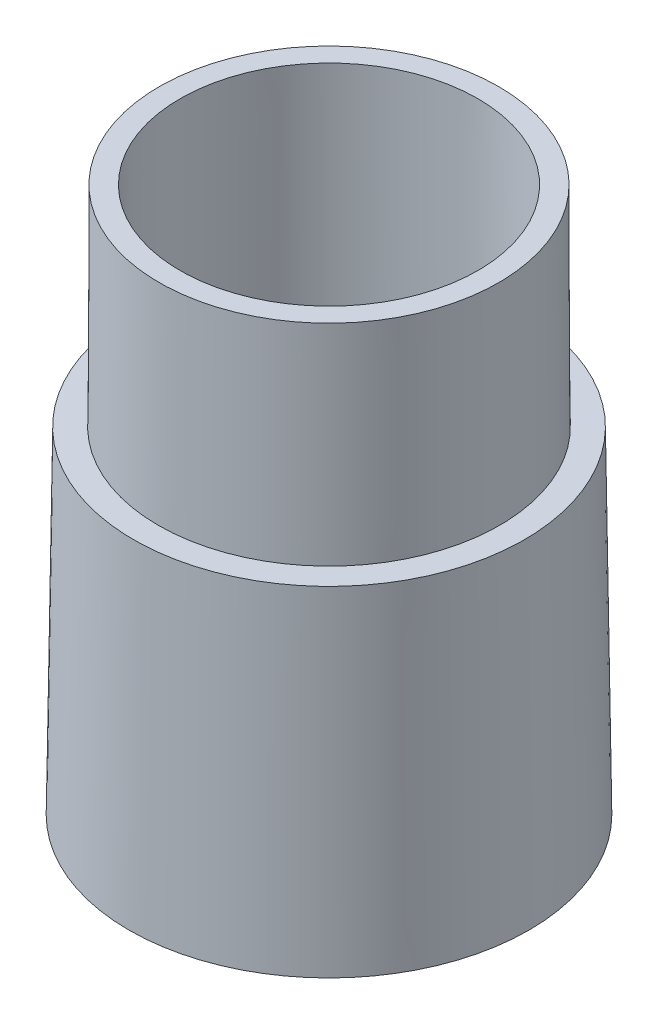
ISO-10303-21;
HEADER;
FILE_DESCRIPTION(('STEP AP214'),'2;1');
FILE_NAME('part.step','',(''),(''),'','','');
FILE_SCHEMA(('AUTOMOTIVE_DESIGN { 1 0 10303 214 1 1 1 1 }'));
ENDSEC;
DATA;
#1=APPLICATION_CONTEXT('core data for automotive mechanical design processes');
#2=APPLICATION_PROTOCOL_DEFINITION('international standard','automotive_design',2000,#1);
#3=PRODUCT_CONTEXT('',#1,'mechanical');
#4=PRODUCT('Part','Part','',(#3));
#5=PRODUCT_RELATED_PRODUCT_CATEGORY('part','',(#4));
#6=PRODUCT_DEFINITION_FORMATION('','',#4);
#7=PRODUCT_DEFINITION_CONTEXT('part definition',#1,'design');
#8=PRODUCT_DEFINITION('design','',#6,#7);
#9=PRODUCT_DEFINITION_SHAPE('','',#8);
#10=(LENGTH_UNIT() NAMED_UNIT(*) SI_UNIT(.MILLI.,.METRE.));
#11=(NAMED_UNIT(*) PLANE_ANGLE_UNIT() SI_UNIT($,.RADIAN.));
#12=(NAMED_UNIT(*) SI_UNIT($,.STERADIAN.) SOLID_ANGLE_UNIT());
#13=UNCERTAINTY_MEASURE_WITH_UNIT(LENGTH_MEASURE(1.E-05),#10,'distance_accuracy_value','');
#14=(GEOMETRIC_REPRESENTATION_CONTEXT(3) GLOBAL_UNCERTAINTY_ASSIGNED_CONTEXT((#13)) GLOBAL_UNIT_ASSIGNED_CONTEXT((#10,
#11,#12)) REPRESENTATION_CONTEXT('',''));
#15=CARTESIAN_POINT('',(0.,0.,0.));
#16=DIRECTION('',(0.,0.,1.));
#17=DIRECTION('',(1.,0.,0.));
#18=AXIS2_PLACEMENT_3D('',#15,#16,#17);
#19=CARTESIAN_POINT('',(0.,0.,0.));
#20=DIRECTION('',(0.,-1.,0.));
#21=DIRECTION('',(0.,0.,-1.));
#22=AXIS2_PLACEMENT_3D('',#19,#20,#21);
#23=CONICAL_SURFACE('',#22,8.81,0.0134964809963496);
#24=CARTESIAN_POINT('',(8.60823091124179,14.68,-0.249973663442214));
#25=CARTESIAN_POINT('',(8.61048079432087,14.5133788704425,-0.249973677197637));
#26=CARTESIAN_POINT('',(8.6127306766579,14.346757740875,-0.24997369093714));
#27=CARTESIAN_POINT('',(8.61948032144782,13.8468943521425,-0.249973732107752));
#28=CARTESIAN_POINT('',(8.62398008167954,13.5136520929476,-0.249973759490965));
#29=CARTESIAN_POINT('',(8.63297959624633,12.847167574478,-0.249973814128946));
#30=CARTESIAN_POINT('',(8.63747935058139,12.5139253152034,-0.249973841383713));
#31=CARTESIAN_POINT('',(8.64647885338279,11.8474407965749,-0.249973895766013));
#32=CARTESIAN_POINT('',(8.65097860184912,11.5141985372211,-0.249973922893545));
#33=CARTESIAN_POINT('',(8.65772822016752,11.0143351481312,-0.24997396348992));
#34=CARTESIAN_POINT('',(8.65997809221014,10.8477140184247,-0.249973977006225));
#35=CARTESIAN_POINT('',(8.66672770615257,10.3478506292757,-0.24997401750784));
#36=CARTESIAN_POINT('',(8.67122744586696,10.0146083698036,-0.249974044445849));
#37=CARTESIAN_POINT('',(8.6802269194951,9.34812385078127,-0.249974098196511));
#38=CARTESIAN_POINT('',(8.68472665340884,9.01488159123092,-0.249974125009163));
#39=CARTESIAN_POINT('',(8.69372611546264,8.34839707205227,-0.249974178509888));
#40=CARTESIAN_POINT('',(8.6982258436027,8.01515481242396,-0.249974205197961));
#41=CARTESIAN_POINT('',(8.70722529413595,7.34867029308974,-0.249974258450297));
#42=CARTESIAN_POINT('',(8.71172501652913,7.01542803338383,-0.249974285014562));
#43=CARTESIAN_POINT('',(8.71847459582874,6.51556464376704,-0.249974324768674));
#44=CARTESIAN_POINT('',(8.72072445488024,6.34894351388513,-0.249974338004665));
#45=CARTESIAN_POINT('',(8.72747402989463,5.84908012421047,-0.249974377666637));
#46=CARTESIAN_POINT('',(8.73197374371739,5.51583786438884,-0.249974404046619));
#47=CARTESIAN_POINT('',(8.74097316568232,4.84935334466887,-0.249974456684676));
#48=CARTESIAN_POINT('',(8.74547287382449,4.51611108477053,-0.24997448294275));
#49=CARTESIAN_POINT('',(8.75447228445447,3.8496265648975,-0.24997453533774));
#50=CARTESIAN_POINT('',(8.75897198694229,3.51638430492282,-0.249974561474655));
#51=CARTESIAN_POINT('',(8.76797138628963,2.84989978489744,-0.249974613628073));
#52=CARTESIAN_POINT('',(8.77247108314914,2.51665752484676,-0.249974639644575));
#53=CARTESIAN_POINT('',(8.77922062423663,2.016794134714,-0.249974678579571));
#54=CARTESIAN_POINT('',(8.7814704705655,1.85017300466029,-0.249974691542943));
#55=CARTESIAN_POINT('',(8.78750908318868,1.40295989555099,-0.249974726296762));
#56=CARTESIAN_POINT('',(8.79129784820028,1.12236791647808,-0.249974748059829));
#57=CARTESIAN_POINT('',(8.79887537427599,0.561183958278966,-0.249974791501812));
#58=CARTESIAN_POINT('',(8.80266413534011,0.280591979152757,-0.249974813180727));
#59=CARTESIAN_POINT('',(8.80645289443814,0.,-0.249974834817786));
#60=B_SPLINE_CURVE_WITH_KNOTS('',3,(#24,#25,#26,#27,#28,#29,#30,#31,#32,#33,#34,#35,#36,#37,#38,
#39,#40,#41,#42,#43,#44,#45,#46,#47,#48,#49,#50,#51,#52,#53,#54,#55,#56,#57,#58,#59),
.UNSPECIFIED.,.F.,.F.,(4,2,2,2,2,2,2,2,2,2,2,2,2,2,2,2,2,4),(0.,0.499908956811049,
1.49972687043315,2.49954478405525,3.49936269767735,3.99927165448839,4.99908956811049,
5.99890748173259,6.99872539535469,7.99854330897679,8.49845226578784,9.49827017940993,
10.498088093032,11.4979060066541,12.4977239202762,12.9976328770873,13.8394855489624,
14.6813382208375),.UNSPECIFIED.);
#61=CARTESIAN_POINT('',(8.6082309112409,14.68,-0.249973663441146));
#62=VERTEX_POINT('',#61);
#63=CARTESIAN_POINT('',(8.80645289443814,0.,-0.249974834817826));
#64=VERTEX_POINT('',#63);
#65=EDGE_CURVE('E117',#62,#64,#60,.T.);
#66=ORIENTED_EDGE('',*,*,#65,.F.);
#67=CARTESIAN_POINT('',(0.,14.68,0.));
#68=DIRECTION('',(0.,-1.,0.));
#69=DIRECTION('',(0.,0.,-1.));
#70=AXIS2_PLACEMENT_3D('',#67,#68,#69);
#71=CIRCLE('',#70,8.61185962807439);
#72=CARTESIAN_POINT('',(0.249973663441056,14.68,-8.6082309112409));
#73=VERTEX_POINT('',#72);
#74=EDGE_CURVE('E105',#73,#62,#71,.T.);
#75=ORIENTED_EDGE('',*,*,#74,.F.);
#76=CARTESIAN_POINT('',(0.249974834817693,0.,-8.80645289443814));
#77=CARTESIAN_POINT('',(0.249974821969175,0.166621129699813,-8.80420305350192));
#78=CARTESIAN_POINT('',(0.249974809105898,0.333242259390264,-8.80195321187241));
#79=CARTESIAN_POINT('',(0.249974744715482,1.16634790779561,-8.79070400025044));
#80=CARTESIAN_POINT('',(0.249974692966261,1.83283242636976,-8.78170461983467));
#81=CARTESIAN_POINT('',(0.249974588988193,3.16580146321502,-8.7637058365611));
#82=CARTESIAN_POINT('',(0.249974536759346,3.83228598148614,-8.75470643370331));
#83=CARTESIAN_POINT('',(0.249974431816078,5.16525501772254,-8.73670760533735));
#84=CARTESIAN_POINT('',(0.249974379101658,5.83173953568781,-8.72770817982918));
#85=CARTESIAN_POINT('',(0.249974273181206,7.16470857130967,-8.70970930595159));
#86=CARTESIAN_POINT('',(0.249974219975175,7.83119308896625,-8.70070985758216));
#87=CARTESIAN_POINT('',(0.24997411306537,9.16416212396785,-8.68271093776855));
#88=CARTESIAN_POINT('',(0.249974059361596,9.83064664131285,-8.67371146632436));
#89=CARTESIAN_POINT('',(0.249973977186892,10.8457035621321,-8.6600052400604));
#90=CARTESIAN_POINT('',(0.249973948899022,11.1942759657205,-8.65529849370074));
#91=CARTESIAN_POINT('',(0.249973878005905,12.0657069745836,-8.64353161979906));
#92=CARTESIAN_POINT('',(0.249973835313937,12.5885655798042,-8.63647148825576));
#93=CARTESIAN_POINT('',(0.249973749614724,13.6342827900494,-8.62235121065818));
#94=CARTESIAN_POINT('',(0.24997370660748,14.157141395074,-8.61529106460389));
#95=CARTESIAN_POINT('',(0.249973663441056,14.68,-8.6082309112409));
#96=B_SPLINE_CURVE_WITH_KNOTS('',3,(#76,#77,#78,#79,#80,#81,#82,#83,#84,#85,#86,#87,#88,#89,#90,
#91,#92,#93,#94,#95),.UNSPECIFIED.,.F.,.F.,(4,2,2,2,2,2,2,2,2,4),(0.,0.499908955531027,
2.49954477765514,4.49918059977925,6.49881642190336,8.49845224402747,10.4980880661516,
11.5439006048231,13.1126194128303,14.6813382208375),.UNSPECIFIED.);
#97=CARTESIAN_POINT('',(0.249974834817693,0.,-8.80645289443814));
#98=VERTEX_POINT('',#97);
#99=EDGE_CURVE('E47',#98,#73,#96,.T.);
#100=ORIENTED_EDGE('',*,*,#99,.F.);
#101=CARTESIAN_POINT('',(0.,0.,0.));
#102=DIRECTION('',(0.,-1.,0.));
#103=DIRECTION('',(0.,0.,-1.));
#104=AXIS2_PLACEMENT_3D('',#101,#102,#103);
#105=CIRCLE('',#104,8.81);
#106=EDGE_CURVE('E62',#98,#64,#105,.T.);
#107=ORIENTED_EDGE('',*,*,#106,.T.);
#108=EDGE_LOOP('',(#66,#75,#100,#107));
#109=FACE_BOUND('',#108,.T.);
#110=ADVANCED_FACE('F33',(#109),#23,.F.);
#111=CARTESIAN_POINT('',(8.80645289443808,0.,0.249974834817627));
#112=CARTESIAN_POINT('',(8.80420305350189,0.166621129699812,0.249974821969095));
#113=CARTESIAN_POINT('',(8.8019532118724,0.333242259390263,0.24997480910581));
#114=CARTESIAN_POINT('',(8.79520368489924,0.833105648433467,0.249974770471547));
#115=CARTESIAN_POINT('',(8.79070399747087,1.16634790775807,0.249974744656164));
#116=CARTESIAN_POINT('',(8.78170461702939,1.83283242633187,0.249974692906217));
#117=CARTESIAN_POINT('',(8.77720492401628,2.16607468558106,0.249974666971653));
#118=CARTESIAN_POINT('',(8.76820553237951,2.83255920400369,0.249974614982618));
#119=CARTESIAN_POINT('',(8.76370583375584,3.16580146317713,0.249974588928147));
#120=CARTESIAN_POINT('',(8.75470643087199,3.8322859814479,0.249974536698557));
#121=CARTESIAN_POINT('',(8.75020672661182,4.16552824054522,0.249974510523437));
#122=CARTESIAN_POINT('',(8.74120731242884,4.83201275866342,0.249974458051804));
#123=CARTESIAN_POINT('',(8.73670760250603,5.16525501768428,0.249974431755289));
#124=CARTESIAN_POINT('',(8.72770817697151,5.8317395356492,0.249974379040115));
#125=CARTESIAN_POINT('',(8.72320846135979,6.16498179459325,0.249974352621454));
#126=CARTESIAN_POINT('',(8.71420902442099,6.83146631240417,0.249974299661228));
#127=CARTESIAN_POINT('',(8.70970930309391,7.16470857127105,0.249974273119663));
#128=CARTESIAN_POINT('',(8.70295971679683,7.66457195951321,0.249974233214565));
#129=CARTESIAN_POINT('',(8.70070985398006,7.83119308891758,0.249974219897407));
#130=CARTESIAN_POINT('',(8.69396026337149,8.33105647710152,0.249974179899414));
#131=CARTESIAN_POINT('',(8.68946053342143,8.66429873585197,0.249974153172059));
#132=CARTESIAN_POINT('',(8.68046106773914,9.33078325327477,0.249974099592525));
#133=CARTESIAN_POINT('',(8.67596133200691,9.66402551194714,0.249974072740346));
#134=CARTESIAN_POINT('',(8.66696185473323,10.3305100292134,0.249974018910385));
#135=CARTESIAN_POINT('',(8.66246211319179,10.6637522878074,0.249973991932604));
#136=CARTESIAN_POINT('',(8.65571249650232,11.1636156756391,0.24997395137114));
#137=CARTESIAN_POINT('',(8.65346262354294,11.3302368049065,0.249973937834854));
#138=CARTESIAN_POINT('',(8.64671300247105,11.8301001926791,0.249973897178452));
#139=CARTESIAN_POINT('',(8.64221325216476,12.1633424511547,0.249973870010793));
#140=CARTESIAN_POINT('',(8.63279974133938,12.8604872580871,0.249973813042443));
#141=CARTESIAN_POINT('',(8.62788598025466,13.2243898065363,0.249973783229474));
#142=CARTESIAN_POINT('',(8.61805845104039,13.9521949033396,0.249973723450362));
#143=CARTESIAN_POINT('',(8.61314468291086,14.3160974516937,0.249973693484219));
#144=CARTESIAN_POINT('',(8.6082309112409,14.68,0.249973663440966));
#145=B_SPLINE_CURVE_WITH_KNOTS('',3,(#111,#112,#113,#114,#115,#116,#117,#118,#119,#120,#121,
#122,#123,#124,#125,#126,#127,#128,#129,#130,#131,#132,#133,#134,#135,#136,#137,#138,#139,#140,
#141,#142,#143,#144),.UNSPECIFIED.,.F.,.F.,(4,2,2,2,2,2,2,2,2,2,2,2,2,2,2,2,4),(0.,
0.499908955531025,1.49972686659307,2.49954477765512,3.49936268871717,4.49918059977923,
5.49899851084128,6.49881642190333,7.49863433296537,7.9985432884964,8.99836119955845,
9.9981791106205,10.9979970216826,11.4979059772136,12.4977238882756,13.5895310545566,
14.6813382208375),.UNSPECIFIED.);
#146=CARTESIAN_POINT('',(8.80645289443814,0.,0.249974834817641));
#147=VERTEX_POINT('',#146);
#148=CARTESIAN_POINT('',(8.6082309112409,14.68,0.24997366344097));
#149=VERTEX_POINT('',#148);
#150=EDGE_CURVE('E54',#147,#149,#145,.T.);
#151=ORIENTED_EDGE('',*,*,#150,.F.);
#152=CARTESIAN_POINT('',(0.249974834817734,0.,8.80645289443814));
#153=VERTEX_POINT('',#152);
#154=EDGE_CURVE('E208',#147,#153,#105,.T.);
#155=ORIENTED_EDGE('',*,*,#154,.T.);
#156=CARTESIAN_POINT('',(0.249973663441055,14.68,8.6082309112409));
#157=CARTESIAN_POINT('',(0.249973677197048,14.5133788704425,8.61048079432044));
#158=CARTESIAN_POINT('',(0.249973690936876,14.346757740875,8.61273067665775));
#159=CARTESIAN_POINT('',(0.249973759555432,13.5136520929876,8.6239800846417));
#160=CARTESIAN_POINT('',(0.249973814192425,12.8471675745176,8.63297959918067));
#161=CARTESIAN_POINT('',(0.24997392295712,11.5141985372607,8.65097860478353));
#162=CARTESIAN_POINT('',(0.249973977084823,10.8477140184738,8.65997809584741));
#163=CARTESIAN_POINT('',(0.249974084837249,9.51474498058589,8.67797705471856));
#164=CARTESIAN_POINT('',(0.249974138461971,8.84826046148492,8.68697652252581));
#165=CARTESIAN_POINT('',(0.249974245214647,7.51529142297186,8.70497543509946));
#166=CARTESIAN_POINT('',(0.249974298342601,6.84880690355977,8.71397487986584));
#167=CARTESIAN_POINT('',(0.24997440410786,5.51583786442736,8.73197374657087));
#168=CARTESIAN_POINT('',(0.249974456745164,4.84935334470704,8.74097316850952));
#169=CARTESIAN_POINT('',(0.249974536542811,3.83429642293051,8.75467928437489));
#170=CARTESIAN_POINT('',(0.249974563879188,3.48572402098524,8.75938598651703));
#171=CARTESIAN_POINT('',(0.249974632055494,2.61429301601816,8.77115273417648));
#172=CARTESIAN_POINT('',(0.249974672813105,2.09143441294439,8.77821277584587));
#173=CARTESIAN_POINT('',(0.249974754034819,1.04571720661113,8.79233284543175));
#174=CARTESIAN_POINT('',(0.249974794498923,0.522858603351655,8.79939287334824));
#175=CARTESIAN_POINT('',(0.249974834817693,0.,8.80645289443814));
#176=B_SPLINE_CURVE_WITH_KNOTS('',3,(#156,#157,#158,#159,#160,#161,#162,#163,#164,#165,#166,
#167,#168,#169,#170,#171,#172,#173,#174,#175),.UNSPECIFIED.,.F.,.F.,(4,2,2,2,2,2,2,2,2,4),(0.,
0.499908956811054,2.49954478405525,4.49918061129946,6.49881643854366,8.49845226578786,
10.4980880930321,11.5439006249834,13.1126194229105,14.6813382208375),.UNSPECIFIED.);
#177=CARTESIAN_POINT('',(0.249973663441056,14.68,8.6082309112409));
#178=VERTEX_POINT('',#177);
#179=EDGE_CURVE('E176',#178,#153,#176,.T.);
#180=ORIENTED_EDGE('',*,*,#179,.F.);
#181=EDGE_CURVE('E114',#149,#178,#71,.T.);
#182=ORIENTED_EDGE('',*,*,#181,.F.);
#183=EDGE_LOOP('',(#151,#155,#180,#182));
#184=FACE_BOUND('',#183,.T.);
#185=ADVANCED_FACE('F249',(#184),#23,.F.);
#186=CARTESIAN_POINT('',(-0.249974834817694,0.,8.80645289443814));
#187=CARTESIAN_POINT('',(-0.249974821969176,0.166621129699813,8.80420305350191));
#188=CARTESIAN_POINT('',(-0.249974809105898,0.333242259390264,8.80195321187241));
#189=CARTESIAN_POINT('',(-0.249974744715481,1.16634790779561,8.79070400025044));
#190=CARTESIAN_POINT('',(-0.249974692966261,1.83283242636976,8.78170461983467));
#191=CARTESIAN_POINT('',(-0.249974588988193,3.16580146321502,8.7637058365611));
#192=CARTESIAN_POINT('',(-0.249974536759346,3.83228598148614,8.75470643370331));
#193=CARTESIAN_POINT('',(-0.249974431816078,5.16525501772253,8.73670760533735));
#194=CARTESIAN_POINT('',(-0.249974379101658,5.83173953568781,8.72770817982918));
#195=CARTESIAN_POINT('',(-0.249974273181206,7.16470857130967,8.70970930595159));
#196=CARTESIAN_POINT('',(-0.249974219975175,7.83119308896625,8.70070985758216));
#197=CARTESIAN_POINT('',(-0.24997411306537,9.16416212396784,8.68271093776854));
#198=CARTESIAN_POINT('',(-0.249974059361596,9.83064664131285,8.67371146632436));
#199=CARTESIAN_POINT('',(-0.249973977186892,10.8457035621321,8.6600052400604));
#200=CARTESIAN_POINT('',(-0.249973948899022,11.1942759657205,8.65529849370075));
#201=CARTESIAN_POINT('',(-0.249973878005905,12.0657069745836,8.64353161979906));
#202=CARTESIAN_POINT('',(-0.249973835313937,12.5885655798042,8.63647148825576));
#203=CARTESIAN_POINT('',(-0.249973749614724,13.6342827900494,8.62235121065818));
#204=CARTESIAN_POINT('',(-0.24997370660748,14.157141395074,8.61529106460389));
#205=CARTESIAN_POINT('',(-0.249973663441056,14.68,8.6082309112409));
#206=B_SPLINE_CURVE_WITH_KNOTS('',3,(#186,#187,#188,#189,#190,#191,#192,#193,#194,#195,#196,
#197,#198,#199,#200,#201,#202,#203,#204,#205),.UNSPECIFIED.,.F.,.F.,(4,2,2,2,2,2,2,2,2,4),(0.,
0.499908955531027,2.49954477765514,4.49918059977924,6.49881642190335,8.49845224402746,
10.4980880661516,11.5439006048231,13.1126194128303,14.6813382208375),.UNSPECIFIED.);
#207=CARTESIAN_POINT('',(-0.249974834817734,0.,8.80645289443814));
#208=VERTEX_POINT('',#207);
#209=CARTESIAN_POINT('',(-0.24997366344106,14.68,8.6082309112409));
#210=VERTEX_POINT('',#209);
#211=EDGE_CURVE('E169',#208,#210,#206,.T.);
#212=ORIENTED_EDGE('',*,*,#211,.F.);
#213=CARTESIAN_POINT('',(-8.80645289443814,0.,0.249974834817764));
#214=VERTEX_POINT('',#213);
#215=EDGE_CURVE('E271',#208,#214,#105,.T.);
#216=ORIENTED_EDGE('',*,*,#215,.T.);
#217=CARTESIAN_POINT('',(-8.6082309112409,14.68,0.249973663441088));
#218=CARTESIAN_POINT('',(-8.61048079432044,14.5133788704425,0.24997367719708));
#219=CARTESIAN_POINT('',(-8.61273067665775,14.346757740875,0.249973690936906));
#220=CARTESIAN_POINT('',(-8.6239800846417,13.5136520929876,0.24997375955546));
#221=CARTESIAN_POINT('',(-8.63297959918066,12.8471675745176,0.249973814192454));
#222=CARTESIAN_POINT('',(-8.65097860478352,11.5141985372607,0.249973922957151));
#223=CARTESIAN_POINT('',(-8.65997809584742,10.8477140184738,0.249973977084854));
#224=CARTESIAN_POINT('',(-8.67797705471857,9.51474498058589,0.249974084837279));
#225=CARTESIAN_POINT('',(-8.68697652252582,8.84826046148492,0.249974138462001));
#226=CARTESIAN_POINT('',(-8.70497543509946,7.51529142297186,0.249974245214677));
#227=CARTESIAN_POINT('',(-8.71397487986584,6.84880690355977,0.249974298342632));
#228=CARTESIAN_POINT('',(-8.73197374657087,5.51583786442736,0.24997440410789));
#229=CARTESIAN_POINT('',(-8.74097316850952,4.84935334470704,0.249974456745194));
#230=CARTESIAN_POINT('',(-8.75467928437489,3.83429642293051,0.249974536542841));
#231=CARTESIAN_POINT('',(-8.75938598651702,3.48572402098524,0.249974563879219));
#232=CARTESIAN_POINT('',(-8.77115273417648,2.61429301601816,0.249974632055525));
#233=CARTESIAN_POINT('',(-8.77821277584586,2.09143441294438,0.249974672813135));
#234=CARTESIAN_POINT('',(-8.79233284543174,1.04571720661113,0.24997475403485));
#235=CARTESIAN_POINT('',(-8.79939287334824,0.522858603351655,0.249974794498954));
#236=CARTESIAN_POINT('',(-8.80645289443814,0.,0.249974834817724));
#237=B_SPLINE_CURVE_WITH_KNOTS('',3,(#217,#218,#219,#220,#221,#222,#223,#224,#225,#226,#227,
#228,#229,#230,#231,#232,#233,#234,#235,#236),.UNSPECIFIED.,.F.,.F.,(4,2,2,2,2,2,2,2,2,4),(0.,
0.49990895681105,2.49954478405525,4.49918061129945,6.49881643854365,8.49845226578786,
10.4980880930321,11.5439006249834,13.1126194229105,14.6813382208375),.UNSPECIFIED.);
#238=CARTESIAN_POINT('',(-8.6082309112409,14.68,0.249973663441086));
#239=VERTEX_POINT('',#238);
#240=EDGE_CURVE('E196',#239,#214,#237,.T.);
#241=ORIENTED_EDGE('',*,*,#240,.F.);
#242=EDGE_CURVE('E274',#210,#239,#71,.T.);
#243=ORIENTED_EDGE('',*,*,#242,.F.);
#244=EDGE_LOOP('',(#212,#216,#241,#243));
#245=FACE_BOUND('',#244,.T.);
#246=ADVANCED_FACE('F254',(#245),#23,.F.);
#247=CARTESIAN_POINT('',(-8.80645289443814,0.,-0.249974834817663));
#248=CARTESIAN_POINT('',(-8.80420305350192,0.166621129699811,-0.249974821969145));
#249=CARTESIAN_POINT('',(-8.80195321187241,0.333242259390262,-0.249974809105867));
#250=CARTESIAN_POINT('',(-8.79070400025044,1.1663479077956,-0.249974744715451));
#251=CARTESIAN_POINT('',(-8.78170461983467,1.83283242636974,-0.24997469296623));
#252=CARTESIAN_POINT('',(-8.76370583656111,3.165801463215,-0.249974588988163));
#253=CARTESIAN_POINT('',(-8.75470643370332,3.83228598148612,-0.249974536759315));
#254=CARTESIAN_POINT('',(-8.73670760533736,5.1652550177225,-0.249974431816048));
#255=CARTESIAN_POINT('',(-8.72770817982919,5.83173953568777,-0.249974379101628));
#256=CARTESIAN_POINT('',(-8.70970930595159,7.16470857130963,-0.249974273181176));
#257=CARTESIAN_POINT('',(-8.70070985758216,7.8311930889662,-0.249974219975145));
#258=CARTESIAN_POINT('',(-8.68271093776855,9.16416212396779,-0.24997411306534));
#259=CARTESIAN_POINT('',(-8.67371146632437,9.83064664131279,-0.249974059361566));
#260=CARTESIAN_POINT('',(-8.66000524006041,10.845703562132,-0.249973977186862));
#261=CARTESIAN_POINT('',(-8.65529849370074,11.1942759657205,-0.249973948898992));
#262=CARTESIAN_POINT('',(-8.64353161979905,12.0657069745835,-0.249973878005875));
#263=CARTESIAN_POINT('',(-8.63647148825576,12.5885655798041,-0.249973835313907));
#264=CARTESIAN_POINT('',(-8.62235121065818,13.6342827900494,-0.249973749614694));
#265=CARTESIAN_POINT('',(-8.6152910646039,14.157141395074,-0.24997370660745));
#266=CARTESIAN_POINT('',(-8.6082309112409,14.68,-0.249973663441026));
#267=B_SPLINE_CURVE_WITH_KNOTS('',3,(#247,#248,#249,#250,#251,#252,#253,#254,#255,#256,#257,
#258,#259,#260,#261,#262,#263,#264,#265,#266),.UNSPECIFIED.,.F.,.F.,(4,2,2,2,2,2,2,2,2,4),(0.,
0.499908955531024,2.49954477765512,4.49918059977922,6.49881642190332,8.49845224402741,
10.4980880661515,11.543900604823,13.1126194128303,14.6813382208375),.UNSPECIFIED.);
#268=CARTESIAN_POINT('',(-8.80645289443814,0.,-0.249974834817703));
#269=VERTEX_POINT('',#268);
#270=CARTESIAN_POINT('',(-8.6082309112409,14.68,-0.24997366344103));
#271=VERTEX_POINT('',#270);
#272=EDGE_CURVE('E189',#269,#271,#267,.T.);
#273=ORIENTED_EDGE('',*,*,#272,.F.);
#274=CARTESIAN_POINT('',(-0.249974834817692,0.,-8.80645289443814));
#275=VERTEX_POINT('',#274);
#276=EDGE_CURVE('E207',#269,#275,#105,.T.);
#277=ORIENTED_EDGE('',*,*,#276,.T.);
#278=CARTESIAN_POINT('',(-0.249973663441058,14.68,-8.6082309112409));
#279=CARTESIAN_POINT('',(-0.24997367719705,14.5133788704425,-8.61048079432045));
#280=CARTESIAN_POINT('',(-0.249973690936876,14.346757740875,-8.61273067665775));
#281=CARTESIAN_POINT('',(-0.24997375955543,13.5136520929876,-8.62398008464171));
#282=CARTESIAN_POINT('',(-0.249973814192424,12.8471675745176,-8.63297959918067));
#283=CARTESIAN_POINT('',(-0.249973922957121,11.5141985372607,-8.65097860478352));
#284=CARTESIAN_POINT('',(-0.249973977084823,10.8477140184738,-8.65997809584741));
#285=CARTESIAN_POINT('',(-0.249974084837249,9.5147449805859,-8.67797705471857));
#286=CARTESIAN_POINT('',(-0.249974138461971,8.84826046148493,-8.68697652252582));
#287=CARTESIAN_POINT('',(-0.249974245214647,7.51529142297187,-8.70497543509946));
#288=CARTESIAN_POINT('',(-0.249974298342601,6.84880690355979,-8.71397487986585));
#289=CARTESIAN_POINT('',(-0.24997440410786,5.51583786442737,-8.73197374657087));
#290=CARTESIAN_POINT('',(-0.249974456745164,4.84935334470705,-8.74097316850952));
#291=CARTESIAN_POINT('',(-0.249974536542811,3.83429642293052,-8.75467928437489));
#292=CARTESIAN_POINT('',(-0.249974563879188,3.48572402098526,-8.75938598651703));
#293=CARTESIAN_POINT('',(-0.249974632055494,2.61429301601817,-8.77115273417649));
#294=CARTESIAN_POINT('',(-0.249974672813105,2.09143441294439,-8.77821277584587));
#295=CARTESIAN_POINT('',(-0.249974754034819,1.04571720661114,-8.79233284543175));
#296=CARTESIAN_POINT('',(-0.249974794498923,0.522858603351658,-8.79939287334824));
#297=CARTESIAN_POINT('',(-0.249974834817693,0.,-8.80645289443814));
#298=B_SPLINE_CURVE_WITH_KNOTS('',3,(#278,#279,#280,#281,#282,#283,#284,#285,#286,#287,#288,
#289,#290,#291,#292,#293,#294,#295,#296,#297),.UNSPECIFIED.,.F.,.F.,(4,2,2,2,2,2,2,2,2,4),(0.,
0.49990895681105,2.49954478405525,4.49918061129945,6.49881643854365,8.49845226578784,
10.498088093032,11.5439006249834,13.1126194229105,14.6813382208375),.UNSPECIFIED.);
#299=CARTESIAN_POINT('',(-0.249973663441058,14.68,-8.6082309112409));
#300=VERTEX_POINT('',#299);
#301=EDGE_CURVE('E11',#300,#275,#298,.T.);
#302=ORIENTED_EDGE('',*,*,#301,.F.);
#303=EDGE_CURVE('E116',#271,#300,#71,.T.);
#304=ORIENTED_EDGE('',*,*,#303,.F.);
#305=EDGE_LOOP('',(#273,#277,#302,#304));
#306=FACE_BOUND('',#305,.T.);
#307=ADVANCED_FACE('F250',(#306),#23,.F.);
#308=CARTESIAN_POINT('',(0.,0.,8.81));
#309=DIRECTION('',(0.,1.,0.));
#310=DIRECTION('',(0.,0.,1.));
#311=AXIS2_PLACEMENT_3D('',#308,#309,#310);
#312=PLANE('',#311);
#313=ORIENTED_EDGE('',*,*,#154,.F.);
#314=CARTESIAN_POINT('',(8.81,0.,0.));
#315=DIRECTION('',(0.,-1.,0.));
#316=DIRECTION('',(1.,0.,0.));
#317=AXIS2_PLACEMENT_3D('',#314,#315,#316);
#318=CIRCLE('',#317,0.25);
#319=EDGE_CURVE('E124',#147,#64,#318,.T.);
#320=ORIENTED_EDGE('',*,*,#319,.T.);
#321=ORIENTED_EDGE('',*,*,#106,.F.);
#322=CARTESIAN_POINT('',(0.,0.,-8.81));
#323=DIRECTION('',(0.,-1.,0.));
#324=DIRECTION('',(0.,0.,-1.));
#325=AXIS2_PLACEMENT_3D('',#322,#323,#324);
#326=CIRCLE('',#325,0.25);
#327=EDGE_CURVE('E203',#98,#275,#326,.T.);
#328=ORIENTED_EDGE('',*,*,#327,.T.);
#329=ORIENTED_EDGE('',*,*,#276,.F.);
#330=CARTESIAN_POINT('',(-8.81,0.,0.));
#331=DIRECTION('',(0.,-1.,0.));
#332=DIRECTION('',(-1.,0.,0.));
#333=AXIS2_PLACEMENT_3D('',#330,#331,#332);
#334=CIRCLE('',#333,0.25);
#335=EDGE_CURVE('E183',#269,#214,#334,.T.);
#336=ORIENTED_EDGE('',*,*,#335,.T.);
#337=ORIENTED_EDGE('',*,*,#215,.F.);
#338=CARTESIAN_POINT('',(0.,0.,8.81));
#339=DIRECTION('',(0.,-1.,0.));
#340=DIRECTION('',(0.,0.,1.));
#341=AXIS2_PLACEMENT_3D('',#338,#339,#340);
#342=CIRCLE('',#341,0.25);
#343=EDGE_CURVE('E121',#208,#153,#342,.T.);
#344=ORIENTED_EDGE('',*,*,#343,.T.);
#345=EDGE_LOOP('',(#313,#320,#321,#328,#329,#336,#337,#344));
#346=FACE_BOUND('',#345,.T.);
#347=CARTESIAN_POINT('',(0.,0.,0.));
#348=DIRECTION('',(0.,-1.,0.));
#349=DIRECTION('',(0.,0.,-1.));
#350=AXIS2_PLACEMENT_3D('',#347,#348,#349);
#351=CIRCLE('',#350,9.925);
#352=CARTESIAN_POINT('',(0.,0.,-9.925));
#353=VERTEX_POINT('',#352);
#354=EDGE_CURVE('E224',#353,#353,#351,.T.);
#355=ORIENTED_EDGE('',*,*,#354,.T.);
#356=EDGE_LOOP('',(#355));
#357=FACE_BOUND('',#356,.T.);
#358=ADVANCED_FACE('F35',(#346,#357),#312,.F.);
#359=CARTESIAN_POINT('',(0.,16.67,0.));
#360=DIRECTION('',(0.,-1.,0.));
#361=DIRECTION('',(0.,0.,-1.));
#362=AXIS2_PLACEMENT_3D('',#359,#360,#361);
#363=CONICAL_SURFACE('',#362,9.7,0.0134964809963498);
#364=ORIENTED_EDGE('',*,*,#354,.F.);
#365=EDGE_LOOP('',(#364));
#366=FACE_BOUND('',#365,.T.);
#367=CARTESIAN_POINT('',(0.,16.67,0.));
#368=DIRECTION('',(0.,-1.,0.));
#369=DIRECTION('',(0.,0.,-1.));
#370=AXIS2_PLACEMENT_3D('',#367,#368,#369);
#371=CIRCLE('',#370,9.7);
#372=CARTESIAN_POINT('',(0.,16.67,-9.7));
#373=VERTEX_POINT('',#372);
#374=EDGE_CURVE('E221',#373,#373,#371,.T.);
#375=ORIENTED_EDGE('',*,*,#374,.T.);
#376=EDGE_LOOP('',(#375));
#377=FACE_BOUND('',#376,.T.);
#378=ADVANCED_FACE('F261',(#366,#377),#363,.T.);
#379=CARTESIAN_POINT('',(0.,16.67,9.7));
#380=DIRECTION('',(0.,-1.,0.));
#381=DIRECTION('',(0.,0.,-1.));
#382=AXIS2_PLACEMENT_3D('',#379,#380,#381);
#383=PLANE('',#382);
#384=ORIENTED_EDGE('',*,*,#374,.F.);
#385=EDGE_LOOP('',(#384));
#386=FACE_BOUND('',#385,.T.);
#387=CARTESIAN_POINT('',(0.,16.67,0.));
#388=DIRECTION('',(0.,-1.,0.));
#389=DIRECTION('',(0.,0.,-1.));
#390=AXIS2_PLACEMENT_3D('',#387,#388,#389);
#391=CIRCLE('',#390,8.47);
#392=CARTESIAN_POINT('',(0.,16.67,-8.47));
#393=VERTEX_POINT('',#392);
#394=EDGE_CURVE('E218',#393,#393,#391,.T.);
#395=ORIENTED_EDGE('',*,*,#394,.T.);
#396=EDGE_LOOP('',(#395));
#397=FACE_BOUND('',#396,.T.);
#398=ADVANCED_FACE('F285',(#386,#397),#383,.F.);
#399=CARTESIAN_POINT('',(0.,27.08,0.));
#400=DIRECTION('',(0.,-1.,0.));
#401=DIRECTION('',(0.,0.,-1.));
#402=AXIS2_PLACEMENT_3D('',#399,#400,#401);
#403=CONICAL_SURFACE('',#402,8.425,0.00432273964538714);
#404=ORIENTED_EDGE('',*,*,#394,.F.);
#405=EDGE_LOOP('',(#404));
#406=FACE_BOUND('',#405,.T.);
#407=CARTESIAN_POINT('',(0.,27.08,0.));
#408=DIRECTION('',(0.,-1.,0.));
#409=DIRECTION('',(0.,0.,-1.));
#410=AXIS2_PLACEMENT_3D('',#407,#408,#409);
#411=CIRCLE('',#410,8.425);
#412=CARTESIAN_POINT('',(0.,27.08,-8.425));
#413=VERTEX_POINT('',#412);
#414=EDGE_CURVE('E215',#413,#413,#411,.T.);
#415=ORIENTED_EDGE('',*,*,#414,.T.);
#416=EDGE_LOOP('',(#415));
#417=FACE_BOUND('',#416,.T.);
#418=ADVANCED_FACE('F290',(#406,#417),#403,.T.);
#419=CARTESIAN_POINT('',(0.,27.08,8.425));
#420=DIRECTION('',(0.,-1.,0.));
#421=DIRECTION('',(0.,0.,-1.));
#422=AXIS2_PLACEMENT_3D('',#419,#420,#421);
#423=PLANE('',#422);
#424=ORIENTED_EDGE('',*,*,#414,.F.);
#425=EDGE_LOOP('',(#424));
#426=FACE_BOUND('',#425,.T.);
#427=CARTESIAN_POINT('',(0.,27.08,0.));
#428=DIRECTION('',(0.,-1.,0.));
#429=DIRECTION('',(0.,0.,-1.));
#430=AXIS2_PLACEMENT_3D('',#427,#428,#429);
#431=CIRCLE('',#430,7.39);
#432=CARTESIAN_POINT('',(0.,27.08,-7.39));
#433=VERTEX_POINT('',#432);
#434=EDGE_CURVE('E212',#433,#433,#431,.T.);
#435=ORIENTED_EDGE('',*,*,#434,.T.);
#436=EDGE_LOOP('',(#435));
#437=FACE_BOUND('',#436,.T.);
#438=ADVANCED_FACE('F296',(#426,#437),#423,.F.);
#439=CARTESIAN_POINT('',(0.,14.68,0.));
#440=DIRECTION('',(0.,-1.,0.));
#441=DIRECTION('',(0.,0.,-1.));
#442=AXIS2_PLACEMENT_3D('',#439,#440,#441);
#443=CONICAL_SURFACE('',#442,7.485,0.00766114043377078);
#444=ORIENTED_EDGE('',*,*,#434,.F.);
#445=EDGE_LOOP('',(#444));
#446=FACE_BOUND('',#445,.T.);
#447=CARTESIAN_POINT('',(0.,14.68,0.));
#448=DIRECTION('',(0.,-1.,0.));
#449=DIRECTION('',(0.,0.,-1.));
#450=AXIS2_PLACEMENT_3D('',#447,#448,#449);
#451=CIRCLE('',#450,7.485);
#452=CARTESIAN_POINT('',(0.,14.68,-7.485));
#453=VERTEX_POINT('',#452);
#454=EDGE_CURVE('E113',#453,#453,#451,.T.);
#455=ORIENTED_EDGE('',*,*,#454,.T.);
#456=EDGE_LOOP('',(#455));
#457=FACE_BOUND('',#456,.T.);
#458=ADVANCED_FACE('F247',(#446,#457),#443,.F.);
#459=CARTESIAN_POINT('',(0.,14.68,7.485));
#460=DIRECTION('',(0.,1.,0.));
#461=DIRECTION('',(0.,0.,1.));
#462=AXIS2_PLACEMENT_3D('',#459,#460,#461);
#463=PLANE('',#462);
#464=CARTESIAN_POINT('',(8.61185962807439,14.68,0.));
#465=DIRECTION('',(0.,-1.,0.));
#466=DIRECTION('',(1.,0.,0.));
#467=AXIS2_PLACEMENT_3D('',#464,#465,#466);
#468=CIRCLE('',#467,0.25);
#469=EDGE_CURVE('E109',#149,#62,#468,.T.);
#470=ORIENTED_EDGE('',*,*,#469,.F.);
#471=ORIENTED_EDGE('',*,*,#181,.T.);
#472=CARTESIAN_POINT('',(0.,14.68,8.61185962807439));
#473=DIRECTION('',(0.,-1.,0.));
#474=DIRECTION('',(0.,0.,1.));
#475=AXIS2_PLACEMENT_3D('',#472,#473,#474);
#476=CIRCLE('',#475,0.25);
#477=EDGE_CURVE('E280',#210,#178,#476,.T.);
#478=ORIENTED_EDGE('',*,*,#477,.F.);
#479=ORIENTED_EDGE('',*,*,#242,.T.);
#480=CARTESIAN_POINT('',(-8.61185962807439,14.68,0.));
#481=DIRECTION('',(0.,-1.,0.));
#482=DIRECTION('',(-1.,0.,0.));
#483=AXIS2_PLACEMENT_3D('',#480,#481,#482);
#484=CIRCLE('',#483,0.25);
#485=EDGE_CURVE('E186',#271,#239,#484,.T.);
#486=ORIENTED_EDGE('',*,*,#485,.F.);
#487=ORIENTED_EDGE('',*,*,#303,.T.);
#488=CARTESIAN_POINT('',(0.,14.68,-8.61185962807439));
#489=DIRECTION('',(0.,-1.,0.));
#490=DIRECTION('',(0.,0.,-1.));
#491=AXIS2_PLACEMENT_3D('',#488,#489,#490);
#492=CIRCLE('',#491,0.25);
#493=EDGE_CURVE('E111',#73,#300,#492,.T.);
#494=ORIENTED_EDGE('',*,*,#493,.F.);
#495=ORIENTED_EDGE('',*,*,#74,.T.);
#496=EDGE_LOOP('',(#470,#471,#478,#479,#486,#487,#494,#495));
#497=FACE_BOUND('',#496,.T.);
#498=ORIENTED_EDGE('',*,*,#454,.F.);
#499=EDGE_LOOP('',(#498));
#500=FACE_BOUND('',#499,.T.);
#501=ADVANCED_FACE('F106',(#497,#500),#463,.F.);
#502=CARTESIAN_POINT('',(0.,0.,-9.06));
#503=CARTESIAN_POINT('',(0.,14.68,-8.86185962807439));
#504=CARTESIAN_POINT('',(0.5,0.,-9.06));
#505=CARTESIAN_POINT('',(0.5,14.68,-8.86185962807439));
#506=CARTESIAN_POINT('',(0.5,0.,-8.56));
#507=CARTESIAN_POINT('',(0.5,14.68,-8.36185962807438));
#508=CARTESIAN_POINT('',(0.,0.,-8.56));
#509=CARTESIAN_POINT('',(0.,14.68,-8.36185962807438));
#510=CARTESIAN_POINT('',(-0.5,0.,-8.56));
#511=CARTESIAN_POINT('',(-0.5,14.68,-8.36185962807438));
#512=CARTESIAN_POINT('',(-0.5,0.,-9.06));
#513=CARTESIAN_POINT('',(-0.5,14.68,-8.86185962807439));
#514=CARTESIAN_POINT('',(0.,0.,-9.06));
#515=CARTESIAN_POINT('',(0.,14.68,-8.86185962807439));
#516=(BOUNDED_SURFACE() B_SPLINE_SURFACE(3,1,((#502,#503),(#504,#505),(#506,#507),(#508,#509),
(#510,#511),(#512,#513),(#514,#515)),.UNSPECIFIED.,.T.,.F.,.F.) B_SPLINE_SURFACE_WITH_KNOTS((4,
3,4),(2,2),(0.,0.5,1.),(0.,1.),
.UNSPECIFIED.) GEOMETRIC_REPRESENTATION_ITEM() RATIONAL_B_SPLINE_SURFACE(((1.,1.),
(0.333333333333333,0.333333333333333),(0.333333333333333,0.333333333333333),(1.,1.),
(0.333333333333333,0.333333333333333),(0.333333333333333,0.333333333333333),(1.,1.))) REPRESENTATION_ITEM('') SURFACE());
#517=ORIENTED_EDGE('',*,*,#493,.T.);
#518=ORIENTED_EDGE('',*,*,#301,.T.);
#519=ORIENTED_EDGE('',*,*,#327,.F.);
#520=ORIENTED_EDGE('',*,*,#99,.T.);
#521=EDGE_LOOP('',(#517,#518,#519,#520));
#522=FACE_BOUND('',#521,.T.);
#523=ADVANCED_FACE('F230',(#522),#516,.F.);
#524=CARTESIAN_POINT('',(-9.06,0.,0.));
#525=CARTESIAN_POINT('',(-8.86185962807439,14.68,0.));
#526=CARTESIAN_POINT('',(-9.06,0.,-0.499999999999968));
#527=CARTESIAN_POINT('',(-8.86185962807439,14.68,-0.499999999999969));
#528=CARTESIAN_POINT('',(-8.56,0.,-0.49999999999997));
#529=CARTESIAN_POINT('',(-8.36185962807439,14.68,-0.499999999999971));
#530=CARTESIAN_POINT('',(-8.56,0.,0.));
#531=CARTESIAN_POINT('',(-8.36185962807438,14.68,0.));
#532=CARTESIAN_POINT('',(-8.56,0.,0.50000000000003));
#533=CARTESIAN_POINT('',(-8.36185962807438,14.68,0.500000000000029));
#534=CARTESIAN_POINT('',(-9.06,0.,0.500000000000032));
#535=CARTESIAN_POINT('',(-8.86185962807438,14.68,0.500000000000031));
#536=CARTESIAN_POINT('',(-9.06,0.,0.));
#537=CARTESIAN_POINT('',(-8.86185962807439,14.68,0.));
#538=(BOUNDED_SURFACE() B_SPLINE_SURFACE(3,1,((#524,#525),(#526,#527),(#528,#529),(#530,#531),
(#532,#533),(#534,#535),(#536,#537)),.UNSPECIFIED.,.T.,.F.,.F.) B_SPLINE_SURFACE_WITH_KNOTS((4,
3,4),(2,2),(0.,0.5,1.),(0.,1.),
.UNSPECIFIED.) GEOMETRIC_REPRESENTATION_ITEM() RATIONAL_B_SPLINE_SURFACE(((1.,1.),
(0.333333333333333,0.333333333333333),(0.333333333333333,0.333333333333333),(1.,1.),
(0.333333333333333,0.333333333333333),(0.333333333333333,0.333333333333333),(1.,1.))) REPRESENTATION_ITEM('') SURFACE());
#539=ORIENTED_EDGE('',*,*,#485,.T.);
#540=ORIENTED_EDGE('',*,*,#240,.T.);
#541=ORIENTED_EDGE('',*,*,#335,.F.);
#542=ORIENTED_EDGE('',*,*,#272,.T.);
#543=EDGE_LOOP('',(#539,#540,#541,#542));
#544=FACE_BOUND('',#543,.T.);
#545=ADVANCED_FACE('F157',(#544),#538,.F.);
#546=CARTESIAN_POINT('',(0.,0.,9.06));
#547=CARTESIAN_POINT('',(0.,14.68,8.86185962807439));
#548=CARTESIAN_POINT('',(-0.5,0.,9.06));
#549=CARTESIAN_POINT('',(-0.5,14.68,8.86185962807439));
#550=CARTESIAN_POINT('',(-0.5,0.,8.56));
#551=CARTESIAN_POINT('',(-0.5,14.68,8.36185962807438));
#552=CARTESIAN_POINT('',(0.,0.,8.56));
#553=CARTESIAN_POINT('',(0.,14.68,8.36185962807438));
#554=CARTESIAN_POINT('',(0.5,0.,8.56));
#555=CARTESIAN_POINT('',(0.5,14.68,8.36185962807438));
#556=CARTESIAN_POINT('',(0.5,0.,9.06));
#557=CARTESIAN_POINT('',(0.5,14.68,8.86185962807439));
#558=CARTESIAN_POINT('',(0.,0.,9.06));
#559=CARTESIAN_POINT('',(0.,14.68,8.86185962807439));
#560=(BOUNDED_SURFACE() B_SPLINE_SURFACE(3,1,((#546,#547),(#548,#549),(#550,#551),(#552,#553),
(#554,#555),(#556,#557),(#558,#559)),.UNSPECIFIED.,.T.,.F.,.F.) B_SPLINE_SURFACE_WITH_KNOTS((4,
3,4),(2,2),(0.,0.5,1.),(0.,1.),
.UNSPECIFIED.) GEOMETRIC_REPRESENTATION_ITEM() RATIONAL_B_SPLINE_SURFACE(((1.,1.),
(0.333333333333333,0.333333333333333),(0.333333333333333,0.333333333333333),(1.,1.),
(0.333333333333333,0.333333333333333),(0.333333333333333,0.333333333333333),(1.,1.))) REPRESENTATION_ITEM('') SURFACE());
#561=ORIENTED_EDGE('',*,*,#477,.T.);
#562=ORIENTED_EDGE('',*,*,#179,.T.);
#563=ORIENTED_EDGE('',*,*,#343,.F.);
#564=ORIENTED_EDGE('',*,*,#211,.T.);
#565=EDGE_LOOP('',(#561,#562,#563,#564));
#566=FACE_BOUND('',#565,.T.);
#567=ADVANCED_FACE('F145',(#566),#560,.F.);
#568=CARTESIAN_POINT('',(9.06,0.,0.));
#569=CARTESIAN_POINT('',(8.86185962807439,14.68,0.));
#570=CARTESIAN_POINT('',(9.06000000000001,0.,0.499999999999905));
#571=CARTESIAN_POINT('',(8.86185962807439,14.68,0.499999999999907));
#572=CARTESIAN_POINT('',(8.56000000000001,0.,0.49999999999991));
#573=CARTESIAN_POINT('',(8.36185962807439,14.68,0.499999999999912));
#574=CARTESIAN_POINT('',(8.56,0.,0.));
#575=CARTESIAN_POINT('',(8.36185962807438,14.68,0.));
#576=CARTESIAN_POINT('',(8.56,0.,-0.50000000000009));
#577=CARTESIAN_POINT('',(8.36185962807438,14.68,-0.500000000000088));
#578=CARTESIAN_POINT('',(9.06,0.,-0.500000000000095));
#579=CARTESIAN_POINT('',(8.86185962807438,14.68,-0.500000000000093));
#580=CARTESIAN_POINT('',(9.06,0.,0.));
#581=CARTESIAN_POINT('',(8.86185962807439,14.68,0.));
#582=(BOUNDED_SURFACE() B_SPLINE_SURFACE(3,1,((#568,#569),(#570,#571),(#572,#573),(#574,#575),
(#576,#577),(#578,#579),(#580,#581)),.UNSPECIFIED.,.T.,.F.,.F.) B_SPLINE_SURFACE_WITH_KNOTS((4,
3,4),(2,2),(0.,0.5,1.),(0.,1.),
.UNSPECIFIED.) GEOMETRIC_REPRESENTATION_ITEM() RATIONAL_B_SPLINE_SURFACE(((1.,1.),
(0.333333333333333,0.333333333333333),(0.333333333333333,0.333333333333333),(1.,1.),
(0.333333333333333,0.333333333333333),(0.333333333333333,0.333333333333333),(1.,1.))) REPRESENTATION_ITEM('') SURFACE());
#583=ORIENTED_EDGE('',*,*,#469,.T.);
#584=ORIENTED_EDGE('',*,*,#65,.T.);
#585=ORIENTED_EDGE('',*,*,#319,.F.);
#586=ORIENTED_EDGE('',*,*,#150,.T.);
#587=EDGE_LOOP('',(#583,#584,#585,#586));
#588=FACE_BOUND('',#587,.T.);
#589=ADVANCED_FACE('F123',(#588),#582,.F.);
#590=CLOSED_SHELL('',(#110,#185,#246,#307,#358,#378,#398,#418,#438,#458,#501,#523,#545,#567,#589));
#591=MANIFOLD_SOLID_BREP('B2',#590);
#592=ADVANCED_BREP_SHAPE_REPRESENTATION('',(#18,#591),#14);
#593=SHAPE_DEFINITION_REPRESENTATION(#9,#592);
ENDSEC;
END-ISO-10303-21;
